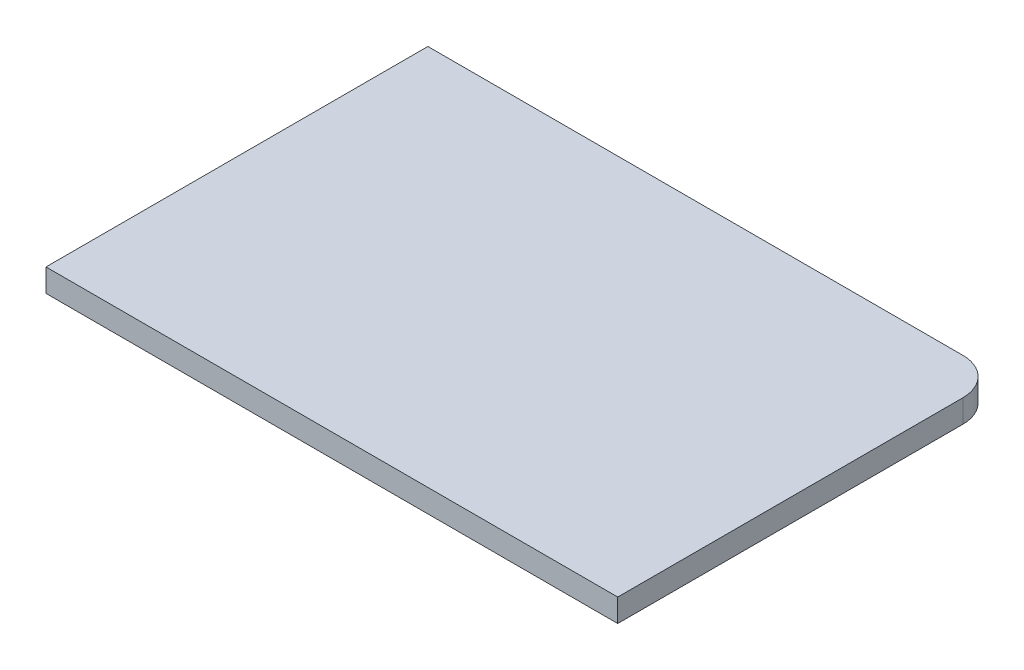
ISO-10303-21;
HEADER;
FILE_DESCRIPTION(('STEP AP214'),'2;1');
FILE_NAME('part.step','',(''),(''),'','','');
FILE_SCHEMA(('AUTOMOTIVE_DESIGN { 1 0 10303 214 1 1 1 1 }'));
ENDSEC;
DATA;
#1=APPLICATION_CONTEXT('core data for automotive mechanical design processes');
#2=APPLICATION_PROTOCOL_DEFINITION('international standard','automotive_design',2000,#1);
#3=PRODUCT_CONTEXT('',#1,'mechanical');
#4=PRODUCT('Part','Part','',(#3));
#5=PRODUCT_RELATED_PRODUCT_CATEGORY('part','',(#4));
#6=PRODUCT_DEFINITION_FORMATION('','',#4);
#7=PRODUCT_DEFINITION_CONTEXT('part definition',#1,'design');
#8=PRODUCT_DEFINITION('design','',#6,#7);
#9=PRODUCT_DEFINITION_SHAPE('','',#8);
#10=(LENGTH_UNIT() NAMED_UNIT(*) SI_UNIT(.MILLI.,.METRE.));
#11=(NAMED_UNIT(*) PLANE_ANGLE_UNIT() SI_UNIT($,.RADIAN.));
#12=(NAMED_UNIT(*) SI_UNIT($,.STERADIAN.) SOLID_ANGLE_UNIT());
#13=UNCERTAINTY_MEASURE_WITH_UNIT(LENGTH_MEASURE(1.E-05),#10,'distance_accuracy_value','');
#14=(GEOMETRIC_REPRESENTATION_CONTEXT(3) GLOBAL_UNCERTAINTY_ASSIGNED_CONTEXT((#13)) GLOBAL_UNIT_ASSIGNED_CONTEXT((#10,
#11,#12)) REPRESENTATION_CONTEXT('',''));
#15=CARTESIAN_POINT('',(0.,0.,0.));
#16=DIRECTION('',(0.,0.,1.));
#17=DIRECTION('',(1.,0.,0.));
#18=AXIS2_PLACEMENT_3D('',#15,#16,#17);
#19=CARTESIAN_POINT('',(54.245,0.,-33.575));
#20=DIRECTION('',(0.,1.,0.));
#21=DIRECTION('',(0.,0.,1.));
#22=AXIS2_PLACEMENT_3D('',#19,#20,#21);
#23=PLANE('',#22);
#24=DIRECTION('',(0.,0.,1.));
#25=VECTOR('',#24,1.);
#26=CARTESIAN_POINT('',(-62.245,0.,41.575));
#27=LINE('',#26,#25);
#28=CARTESIAN_POINT('',(-62.245,0.,-31.575));
#29=VERTEX_POINT('',#28);
#30=CARTESIAN_POINT('',(-62.245,0.,31.575));
#31=VERTEX_POINT('',#30);
#32=EDGE_CURVE('E142',#29,#31,#27,.T.);
#33=ORIENTED_EDGE('',*,*,#32,.F.);
#34=DIRECTION('',(1.,0.,0.));
#35=VECTOR('',#34,1.);
#36=CARTESIAN_POINT('',(21.4,0.,-31.575));
#37=LINE('',#36,#35);
#38=CARTESIAN_POINT('',(52.245,0.,-31.575));
#39=VERTEX_POINT('',#38);
#40=EDGE_CURVE('E230',#29,#39,#37,.T.);
#41=ORIENTED_EDGE('',*,*,#40,.T.);
#42=DIRECTION('',(0.,0.,1.));
#43=VECTOR('',#42,1.);
#44=CARTESIAN_POINT('',(52.245,0.,31.575));
#45=LINE('',#44,#43);
#46=CARTESIAN_POINT('',(52.245,0.,31.575));
#47=VERTEX_POINT('',#46);
#48=EDGE_CURVE('E226',#39,#47,#45,.T.);
#49=ORIENTED_EDGE('',*,*,#48,.T.);
#50=DIRECTION('',(-1.,0.,0.));
#51=VECTOR('',#50,1.);
#52=CARTESIAN_POINT('',(-62.245,0.,31.575));
#53=LINE('',#52,#51);
#54=EDGE_CURVE('E222',#47,#31,#53,.T.);
#55=ORIENTED_EDGE('',*,*,#54,.T.);
#56=EDGE_LOOP('',(#33,#41,#49,#55));
#57=FACE_BOUND('',#56,.T.);
#58=ADVANCED_FACE('F45',(#57),#23,.F.);
#59=CARTESIAN_POINT('',(-62.245,5.,41.575));
#60=DIRECTION('',(1.,0.,0.));
#61=DIRECTION('',(0.,0.,-1.));
#62=AXIS2_PLACEMENT_3D('',#59,#60,#61);
#63=PLANE('',#62);
#64=CARTESIAN_POINT('',(-62.245,0.,-41.575));
#65=VERTEX_POINT('',#64);
#66=CARTESIAN_POINT('',(-62.245,0.,-36.575));
#67=VERTEX_POINT('',#66);
#68=EDGE_CURVE('E137',#65,#67,#27,.T.);
#69=ORIENTED_EDGE('',*,*,#68,.T.);
#70=DIRECTION('',(0.,1.,0.));
#71=VECTOR('',#70,1.);
#72=CARTESIAN_POINT('',(-62.245,-5.,-36.575));
#73=LINE('',#72,#71);
#74=CARTESIAN_POINT('',(-62.245,-5.,-36.575));
#75=VERTEX_POINT('',#74);
#76=EDGE_CURVE('E61',#75,#67,#73,.T.);
#77=ORIENTED_EDGE('',*,*,#76,.F.);
#78=DIRECTION('',(0.,0.,1.));
#79=VECTOR('',#78,1.);
#80=CARTESIAN_POINT('',(-62.245,-5.,-31.575));
#81=LINE('',#80,#79);
#82=CARTESIAN_POINT('',(-62.245,-5.,-31.575));
#83=VERTEX_POINT('',#82);
#84=EDGE_CURVE('E209',#75,#83,#81,.T.);
#85=ORIENTED_EDGE('',*,*,#84,.T.);
#86=DIRECTION('',(0.,1.,0.));
#87=VECTOR('',#86,1.);
#88=CARTESIAN_POINT('',(-62.245,-5.,-31.575));
#89=LINE('',#88,#87);
#90=EDGE_CURVE('E171',#83,#29,#89,.T.);
#91=ORIENTED_EDGE('',*,*,#90,.T.);
#92=ORIENTED_EDGE('',*,*,#32,.T.);
#93=DIRECTION('',(0.,1.,0.));
#94=VECTOR('',#93,1.);
#95=CARTESIAN_POINT('',(-62.245,-5.,31.575));
#96=LINE('',#95,#94);
#97=CARTESIAN_POINT('',(-62.245,-5.,31.575));
#98=VERTEX_POINT('',#97);
#99=EDGE_CURVE('E184',#98,#31,#96,.T.);
#100=ORIENTED_EDGE('',*,*,#99,.F.);
#101=DIRECTION('',(0.,0.,1.));
#102=VECTOR('',#101,1.);
#103=CARTESIAN_POINT('',(-62.245,-5.,36.575));
#104=LINE('',#103,#102);
#105=CARTESIAN_POINT('',(-62.245,-5.,36.575));
#106=VERTEX_POINT('',#105);
#107=EDGE_CURVE('E248',#98,#106,#104,.T.);
#108=ORIENTED_EDGE('',*,*,#107,.T.);
#109=DIRECTION('',(0.,1.,0.));
#110=VECTOR('',#109,1.);
#111=CARTESIAN_POINT('',(-62.245,-5.,36.575));
#112=LINE('',#111,#110);
#113=CARTESIAN_POINT('',(-62.245,0.,36.575));
#114=VERTEX_POINT('',#113);
#115=EDGE_CURVE('E188',#106,#114,#112,.T.);
#116=ORIENTED_EDGE('',*,*,#115,.T.);
#117=CARTESIAN_POINT('',(-62.245,0.,41.575));
#118=VERTEX_POINT('',#117);
#119=EDGE_CURVE('E143',#114,#118,#27,.T.);
#120=ORIENTED_EDGE('',*,*,#119,.T.);
#121=DIRECTION('',(0.,-1.,0.));
#122=VECTOR('',#121,1.);
#123=CARTESIAN_POINT('',(-62.245,5.,41.575));
#124=LINE('',#123,#122);
#125=CARTESIAN_POINT('',(-62.245,5.,41.575));
#126=VERTEX_POINT('',#125);
#127=EDGE_CURVE('E11',#126,#118,#124,.T.);
#128=ORIENTED_EDGE('',*,*,#127,.F.);
#129=DIRECTION('',(0.,0.,1.));
#130=VECTOR('',#129,1.);
#131=CARTESIAN_POINT('',(-62.245,5.,41.575));
#132=LINE('',#131,#130);
#133=CARTESIAN_POINT('',(-62.245,5.,-41.575));
#134=VERTEX_POINT('',#133);
#135=EDGE_CURVE('E153',#134,#126,#132,.T.);
#136=ORIENTED_EDGE('',*,*,#135,.F.);
#137=DIRECTION('',(0.,-1.,0.));
#138=VECTOR('',#137,1.);
#139=CARTESIAN_POINT('',(-62.245,5.,-41.575));
#140=LINE('',#139,#138);
#141=EDGE_CURVE('E133',#134,#65,#140,.T.);
#142=ORIENTED_EDGE('',*,*,#141,.T.);
#143=EDGE_LOOP('',(#69,#77,#85,#91,#92,#100,#108,#116,#120,#128,#136,#142));
#144=FACE_BOUND('',#143,.T.);
#145=ADVANCED_FACE('F47',(#144),#63,.F.);
#146=CARTESIAN_POINT('',(-62.245,5.,41.575));
#147=DIRECTION('',(0.,0.,-1.));
#148=DIRECTION('',(-1.,0.,0.));
#149=AXIS2_PLACEMENT_3D('',#146,#147,#148);
#150=PLANE('',#149);
#151=DIRECTION('',(1.,0.,0.));
#152=VECTOR('',#151,1.);
#153=CARTESIAN_POINT('',(-62.245,0.,41.575));
#154=LINE('',#153,#152);
#155=CARTESIAN_POINT('',(62.245,0.,41.575));
#156=VERTEX_POINT('',#155);
#157=EDGE_CURVE('E141',#118,#156,#154,.T.);
#158=ORIENTED_EDGE('',*,*,#157,.T.);
#159=DIRECTION('',(0.,-1.,0.));
#160=VECTOR('',#159,1.);
#161=CARTESIAN_POINT('',(62.245,5.,41.575));
#162=LINE('',#161,#160);
#163=CARTESIAN_POINT('',(62.245,5.,41.575));
#164=VERTEX_POINT('',#163);
#165=EDGE_CURVE('E54',#164,#156,#162,.T.);
#166=ORIENTED_EDGE('',*,*,#165,.F.);
#167=DIRECTION('',(1.,0.,0.));
#168=VECTOR('',#167,1.);
#169=CARTESIAN_POINT('',(-62.245,5.,41.575));
#170=LINE('',#169,#168);
#171=EDGE_CURVE('E102',#126,#164,#170,.T.);
#172=ORIENTED_EDGE('',*,*,#171,.F.);
#173=ORIENTED_EDGE('',*,*,#127,.T.);
#174=EDGE_LOOP('',(#158,#166,#172,#173));
#175=FACE_BOUND('',#174,.T.);
#176=ADVANCED_FACE('F345',(#175),#150,.F.);
#177=CARTESIAN_POINT('',(62.245,5.,41.575));
#178=DIRECTION('',(-1.,0.,0.));
#179=DIRECTION('',(0.,0.,1.));
#180=AXIS2_PLACEMENT_3D('',#177,#178,#179);
#181=PLANE('',#180);
#182=DIRECTION('',(0.,0.,-1.));
#183=VECTOR('',#182,1.);
#184=CARTESIAN_POINT('',(62.245,0.,41.575));
#185=LINE('',#184,#183);
#186=CARTESIAN_POINT('',(62.245,0.,-33.5749999999999));
#187=VERTEX_POINT('',#186);
#188=EDGE_CURVE('E123',#156,#187,#185,.T.);
#189=ORIENTED_EDGE('',*,*,#188,.T.);
#190=DIRECTION('',(0.,-1.,0.));
#191=VECTOR('',#190,1.);
#192=CARTESIAN_POINT('',(62.245,5.,-33.5749999999999));
#193=LINE('',#192,#191);
#194=CARTESIAN_POINT('',(62.245,5.,-33.5749999999999));
#195=VERTEX_POINT('',#194);
#196=EDGE_CURVE('E120',#195,#187,#193,.T.);
#197=ORIENTED_EDGE('',*,*,#196,.F.);
#198=DIRECTION('',(0.,0.,-1.));
#199=VECTOR('',#198,1.);
#200=CARTESIAN_POINT('',(62.245,5.,41.575));
#201=LINE('',#200,#199);
#202=EDGE_CURVE('E109',#164,#195,#201,.T.);
#203=ORIENTED_EDGE('',*,*,#202,.F.);
#204=ORIENTED_EDGE('',*,*,#165,.T.);
#205=EDGE_LOOP('',(#189,#197,#203,#204));
#206=FACE_BOUND('',#205,.T.);
#207=ADVANCED_FACE('F121',(#206),#181,.F.);
#208=CARTESIAN_POINT('',(54.245,5.,-33.575));
#209=DIRECTION('',(0.,-1.,0.));
#210=DIRECTION('',(0.,0.,-1.));
#211=AXIS2_PLACEMENT_3D('',#208,#209,#210);
#212=CYLINDRICAL_SURFACE('',#211,8.);
#213=CARTESIAN_POINT('',(54.245,0.,-33.575));
#214=DIRECTION('',(0.,1.,0.));
#215=DIRECTION('',(0.,0.,1.));
#216=AXIS2_PLACEMENT_3D('',#213,#214,#215);
#217=CIRCLE('',#216,8.);
#218=CARTESIAN_POINT('',(54.2449999999999,0.,-41.575));
#219=VERTEX_POINT('',#218);
#220=EDGE_CURVE('E148',#187,#219,#217,.T.);
#221=ORIENTED_EDGE('',*,*,#220,.T.);
#222=DIRECTION('',(0.,-1.,0.));
#223=VECTOR('',#222,1.);
#224=CARTESIAN_POINT('',(54.2449999999999,5.,-41.575));
#225=LINE('',#224,#223);
#226=CARTESIAN_POINT('',(54.2449999999999,5.,-41.575));
#227=VERTEX_POINT('',#226);
#228=EDGE_CURVE('E127',#227,#219,#225,.T.);
#229=ORIENTED_EDGE('',*,*,#228,.F.);
#230=CARTESIAN_POINT('',(54.245,5.,-33.575));
#231=DIRECTION('',(0.,1.,0.));
#232=DIRECTION('',(0.,0.,1.));
#233=AXIS2_PLACEMENT_3D('',#230,#231,#232);
#234=CIRCLE('',#233,8.);
#235=EDGE_CURVE('E113',#195,#227,#234,.T.);
#236=ORIENTED_EDGE('',*,*,#235,.F.);
#237=ORIENTED_EDGE('',*,*,#196,.T.);
#238=EDGE_LOOP('',(#221,#229,#236,#237));
#239=FACE_BOUND('',#238,.T.);
#240=ADVANCED_FACE('F129',(#239),#212,.T.);
#241=CARTESIAN_POINT('',(-62.245,5.,-41.575));
#242=DIRECTION('',(0.,0.,1.));
#243=DIRECTION('',(1.,0.,0.));
#244=AXIS2_PLACEMENT_3D('',#241,#242,#243);
#245=PLANE('',#244);
#246=DIRECTION('',(-1.,0.,0.));
#247=VECTOR('',#246,1.);
#248=CARTESIAN_POINT('',(-62.245,0.,-41.575));
#249=LINE('',#248,#247);
#250=EDGE_CURVE('E94',#219,#65,#249,.T.);
#251=ORIENTED_EDGE('',*,*,#250,.T.);
#252=ORIENTED_EDGE('',*,*,#141,.F.);
#253=DIRECTION('',(-1.,0.,0.));
#254=VECTOR('',#253,1.);
#255=CARTESIAN_POINT('',(-62.245,5.,-41.575));
#256=LINE('',#255,#254);
#257=EDGE_CURVE('E70',#227,#134,#256,.T.);
#258=ORIENTED_EDGE('',*,*,#257,.F.);
#259=ORIENTED_EDGE('',*,*,#228,.T.);
#260=EDGE_LOOP('',(#251,#252,#258,#259));
#261=FACE_BOUND('',#260,.T.);
#262=ADVANCED_FACE('F163',(#261),#245,.F.);
#263=CARTESIAN_POINT('',(54.245,5.,-33.575));
#264=DIRECTION('',(0.,1.,0.));
#265=DIRECTION('',(0.,0.,1.));
#266=AXIS2_PLACEMENT_3D('',#263,#264,#265);
#267=PLANE('',#266);
#268=ORIENTED_EDGE('',*,*,#135,.T.);
#269=ORIENTED_EDGE('',*,*,#171,.T.);
#270=ORIENTED_EDGE('',*,*,#202,.T.);
#271=ORIENTED_EDGE('',*,*,#235,.T.);
#272=ORIENTED_EDGE('',*,*,#257,.T.);
#273=EDGE_LOOP('',(#268,#269,#270,#271,#272));
#274=FACE_BOUND('',#273,.T.);
#275=ADVANCED_FACE('F111',(#274),#267,.T.);
#276=ORIENTED_EDGE('',*,*,#119,.F.);
#277=DIRECTION('',(1.,0.,0.));
#278=VECTOR('',#277,1.);
#279=CARTESIAN_POINT('',(-62.245,0.,36.575));
#280=LINE('',#279,#278);
#281=CARTESIAN_POINT('',(57.245,0.,36.575));
#282=VERTEX_POINT('',#281);
#283=EDGE_CURVE('E218',#114,#282,#280,.T.);
#284=ORIENTED_EDGE('',*,*,#283,.T.);
#285=DIRECTION('',(0.,0.,-1.));
#286=VECTOR('',#285,1.);
#287=CARTESIAN_POINT('',(57.245,0.,36.575));
#288=LINE('',#287,#286);
#289=CARTESIAN_POINT('',(57.245,0.,-28.575));
#290=VERTEX_POINT('',#289);
#291=EDGE_CURVE('E214',#282,#290,#288,.T.);
#292=ORIENTED_EDGE('',*,*,#291,.T.);
#293=CARTESIAN_POINT('',(49.245,0.,-28.575));
#294=DIRECTION('',(0.,1.,0.));
#295=DIRECTION('',(0.,0.,1.));
#296=AXIS2_PLACEMENT_3D('',#293,#294,#295);
#297=CIRCLE('',#296,8.);
#298=CARTESIAN_POINT('',(49.245,0.,-36.575));
#299=VERTEX_POINT('',#298);
#300=EDGE_CURVE('E210',#290,#299,#297,.T.);
#301=ORIENTED_EDGE('',*,*,#300,.T.);
#302=DIRECTION('',(-1.,0.,0.));
#303=VECTOR('',#302,1.);
#304=CARTESIAN_POINT('',(49.245,0.,-36.575));
#305=LINE('',#304,#303);
#306=EDGE_CURVE('E206',#299,#67,#305,.T.);
#307=ORIENTED_EDGE('',*,*,#306,.T.);
#308=ORIENTED_EDGE('',*,*,#68,.F.);
#309=ORIENTED_EDGE('',*,*,#250,.F.);
#310=ORIENTED_EDGE('',*,*,#220,.F.);
#311=ORIENTED_EDGE('',*,*,#188,.F.);
#312=ORIENTED_EDGE('',*,*,#157,.F.);
#313=EDGE_LOOP('',(#276,#284,#292,#301,#307,#308,#309,#310,#311,#312));
#314=FACE_BOUND('',#313,.T.);
#315=ADVANCED_FACE('F161',(#314),#23,.F.);
#316=CARTESIAN_POINT('',(49.245,-5.,-36.575));
#317=DIRECTION('',(0.,0.,-1.));
#318=DIRECTION('',(-1.,0.,0.));
#319=AXIS2_PLACEMENT_3D('',#316,#317,#318);
#320=PLANE('',#319);
#321=ORIENTED_EDGE('',*,*,#306,.F.);
#322=DIRECTION('',(0.,1.,0.));
#323=VECTOR('',#322,1.);
#324=CARTESIAN_POINT('',(49.245,-5.,-36.575));
#325=LINE('',#324,#323);
#326=CARTESIAN_POINT('',(49.245,-5.,-36.575));
#327=VERTEX_POINT('',#326);
#328=EDGE_CURVE('E200',#327,#299,#325,.T.);
#329=ORIENTED_EDGE('',*,*,#328,.F.);
#330=DIRECTION('',(-1.,0.,0.));
#331=VECTOR('',#330,1.);
#332=CARTESIAN_POINT('',(49.245,-5.,-36.575));
#333=LINE('',#332,#331);
#334=EDGE_CURVE('E176',#327,#75,#333,.T.);
#335=ORIENTED_EDGE('',*,*,#334,.T.);
#336=ORIENTED_EDGE('',*,*,#76,.T.);
#337=EDGE_LOOP('',(#321,#329,#335,#336));
#338=FACE_BOUND('',#337,.T.);
#339=ADVANCED_FACE('F283',(#338),#320,.T.);
#340=CARTESIAN_POINT('',(49.245,-5.,-28.575));
#341=DIRECTION('',(0.,1.,0.));
#342=DIRECTION('',(0.,0.,1.));
#343=AXIS2_PLACEMENT_3D('',#340,#341,#342);
#344=CYLINDRICAL_SURFACE('',#343,8.);
#345=ORIENTED_EDGE('',*,*,#300,.F.);
#346=DIRECTION('',(0.,1.,0.));
#347=VECTOR('',#346,1.);
#348=CARTESIAN_POINT('',(57.245,-5.,-28.575));
#349=LINE('',#348,#347);
#350=CARTESIAN_POINT('',(57.245,-5.,-28.575));
#351=VERTEX_POINT('',#350);
#352=EDGE_CURVE('E196',#351,#290,#349,.T.);
#353=ORIENTED_EDGE('',*,*,#352,.F.);
#354=CARTESIAN_POINT('',(49.245,-5.,-28.575));
#355=DIRECTION('',(0.,1.,0.));
#356=DIRECTION('',(0.,0.,1.));
#357=AXIS2_PLACEMENT_3D('',#354,#355,#356);
#358=CIRCLE('',#357,8.);
#359=EDGE_CURVE('E236',#351,#327,#358,.T.);
#360=ORIENTED_EDGE('',*,*,#359,.T.);
#361=ORIENTED_EDGE('',*,*,#328,.T.);
#362=EDGE_LOOP('',(#345,#353,#360,#361));
#363=FACE_BOUND('',#362,.T.);
#364=ADVANCED_FACE('F289',(#363),#344,.T.);
#365=CARTESIAN_POINT('',(57.245,-5.,36.575));
#366=DIRECTION('',(1.,0.,0.));
#367=DIRECTION('',(0.,0.,-1.));
#368=AXIS2_PLACEMENT_3D('',#365,#366,#367);
#369=PLANE('',#368);
#370=ORIENTED_EDGE('',*,*,#291,.F.);
#371=DIRECTION('',(0.,1.,0.));
#372=VECTOR('',#371,1.);
#373=CARTESIAN_POINT('',(57.245,-5.,36.575));
#374=LINE('',#373,#372);
#375=CARTESIAN_POINT('',(57.245,-5.,36.575));
#376=VERTEX_POINT('',#375);
#377=EDGE_CURVE('E192',#376,#282,#374,.T.);
#378=ORIENTED_EDGE('',*,*,#377,.F.);
#379=DIRECTION('',(0.,0.,-1.));
#380=VECTOR('',#379,1.);
#381=CARTESIAN_POINT('',(57.245,-5.,36.575));
#382=LINE('',#381,#380);
#383=EDGE_CURVE('E240',#376,#351,#382,.T.);
#384=ORIENTED_EDGE('',*,*,#383,.T.);
#385=ORIENTED_EDGE('',*,*,#352,.T.);
#386=EDGE_LOOP('',(#370,#378,#384,#385));
#387=FACE_BOUND('',#386,.T.);
#388=ADVANCED_FACE('F297',(#387),#369,.T.);
#389=CARTESIAN_POINT('',(-62.245,-5.,36.575));
#390=DIRECTION('',(0.,0.,1.));
#391=DIRECTION('',(1.,0.,0.));
#392=AXIS2_PLACEMENT_3D('',#389,#390,#391);
#393=PLANE('',#392);
#394=ORIENTED_EDGE('',*,*,#283,.F.);
#395=ORIENTED_EDGE('',*,*,#115,.F.);
#396=DIRECTION('',(1.,0.,0.));
#397=VECTOR('',#396,1.);
#398=CARTESIAN_POINT('',(-62.245,-5.,36.575));
#399=LINE('',#398,#397);
#400=EDGE_CURVE('E244',#106,#376,#399,.T.);
#401=ORIENTED_EDGE('',*,*,#400,.T.);
#402=ORIENTED_EDGE('',*,*,#377,.T.);
#403=EDGE_LOOP('',(#394,#395,#401,#402));
#404=FACE_BOUND('',#403,.T.);
#405=ADVANCED_FACE('F304',(#404),#393,.T.);
#406=CARTESIAN_POINT('',(-62.245,-5.,31.575));
#407=DIRECTION('',(0.,0.,-1.));
#408=DIRECTION('',(-1.,0.,0.));
#409=AXIS2_PLACEMENT_3D('',#406,#407,#408);
#410=PLANE('',#409);
#411=ORIENTED_EDGE('',*,*,#54,.F.);
#412=DIRECTION('',(0.,1.,0.));
#413=VECTOR('',#412,1.);
#414=CARTESIAN_POINT('',(52.245,-5.,31.575));
#415=LINE('',#414,#413);
#416=CARTESIAN_POINT('',(52.245,-5.,31.575));
#417=VERTEX_POINT('',#416);
#418=EDGE_CURVE('E180',#417,#47,#415,.T.);
#419=ORIENTED_EDGE('',*,*,#418,.F.);
#420=DIRECTION('',(-1.,0.,0.));
#421=VECTOR('',#420,1.);
#422=CARTESIAN_POINT('',(-62.245,-5.,31.575));
#423=LINE('',#422,#421);
#424=EDGE_CURVE('E252',#417,#98,#423,.T.);
#425=ORIENTED_EDGE('',*,*,#424,.T.);
#426=ORIENTED_EDGE('',*,*,#99,.T.);
#427=EDGE_LOOP('',(#411,#419,#425,#426));
#428=FACE_BOUND('',#427,.T.);
#429=ADVANCED_FACE('F335',(#428),#410,.T.);
#430=CARTESIAN_POINT('',(52.245,-5.,31.575));
#431=DIRECTION('',(-1.,0.,0.));
#432=DIRECTION('',(0.,0.,1.));
#433=AXIS2_PLACEMENT_3D('',#430,#431,#432);
#434=PLANE('',#433);
#435=ORIENTED_EDGE('',*,*,#48,.F.);
#436=DIRECTION('',(0.,1.,0.));
#437=VECTOR('',#436,1.);
#438=CARTESIAN_POINT('',(52.245,-5.,-31.575));
#439=LINE('',#438,#437);
#440=CARTESIAN_POINT('',(52.245,-5.,-31.575));
#441=VERTEX_POINT('',#440);
#442=EDGE_CURVE('E175',#441,#39,#439,.T.);
#443=ORIENTED_EDGE('',*,*,#442,.F.);
#444=DIRECTION('',(0.,0.,1.));
#445=VECTOR('',#444,1.);
#446=CARTESIAN_POINT('',(52.245,-5.,31.575));
#447=LINE('',#446,#445);
#448=EDGE_CURVE('E256',#441,#417,#447,.T.);
#449=ORIENTED_EDGE('',*,*,#448,.T.);
#450=ORIENTED_EDGE('',*,*,#418,.T.);
#451=EDGE_LOOP('',(#435,#443,#449,#450));
#452=FACE_BOUND('',#451,.T.);
#453=ADVANCED_FACE('F330',(#452),#434,.T.);
#454=CARTESIAN_POINT('',(21.4,-5.,-31.575));
#455=DIRECTION('',(0.,0.,1.));
#456=DIRECTION('',(1.,0.,0.));
#457=AXIS2_PLACEMENT_3D('',#454,#455,#456);
#458=PLANE('',#457);
#459=ORIENTED_EDGE('',*,*,#40,.F.);
#460=ORIENTED_EDGE('',*,*,#90,.F.);
#461=DIRECTION('',(1.,0.,0.));
#462=VECTOR('',#461,1.);
#463=CARTESIAN_POINT('',(21.4,-5.,-31.575));
#464=LINE('',#463,#462);
#465=EDGE_CURVE('E260',#83,#441,#464,.T.);
#466=ORIENTED_EDGE('',*,*,#465,.T.);
#467=ORIENTED_EDGE('',*,*,#442,.T.);
#468=EDGE_LOOP('',(#459,#460,#466,#467));
#469=FACE_BOUND('',#468,.T.);
#470=ADVANCED_FACE('F327',(#469),#458,.T.);
#471=CARTESIAN_POINT('',(49.245,-5.,-28.575));
#472=DIRECTION('',(0.,1.,0.));
#473=DIRECTION('',(0.,0.,1.));
#474=AXIS2_PLACEMENT_3D('',#471,#472,#473);
#475=PLANE('',#474);
#476=ORIENTED_EDGE('',*,*,#84,.F.);
#477=ORIENTED_EDGE('',*,*,#334,.F.);
#478=ORIENTED_EDGE('',*,*,#359,.F.);
#479=ORIENTED_EDGE('',*,*,#383,.F.);
#480=ORIENTED_EDGE('',*,*,#400,.F.);
#481=ORIENTED_EDGE('',*,*,#107,.F.);
#482=ORIENTED_EDGE('',*,*,#424,.F.);
#483=ORIENTED_EDGE('',*,*,#448,.F.);
#484=ORIENTED_EDGE('',*,*,#465,.F.);
#485=EDGE_LOOP('',(#476,#477,#478,#479,#480,#481,#482,#483,#484));
#486=FACE_BOUND('',#485,.T.);
#487=ADVANCED_FACE('F277',(#486),#475,.F.);
#488=CLOSED_SHELL('',(#58,#145,#176,#207,#240,#262,#275,#315,#339,#364,#388,#405,#429,#453,#470,#487));
#489=MANIFOLD_SOLID_BREP('B2',#488);
#490=ADVANCED_BREP_SHAPE_REPRESENTATION('',(#18,#489),#14);
#491=SHAPE_DEFINITION_REPRESENTATION(#9,#490);
ENDSEC;
END-ISO-10303-21;
